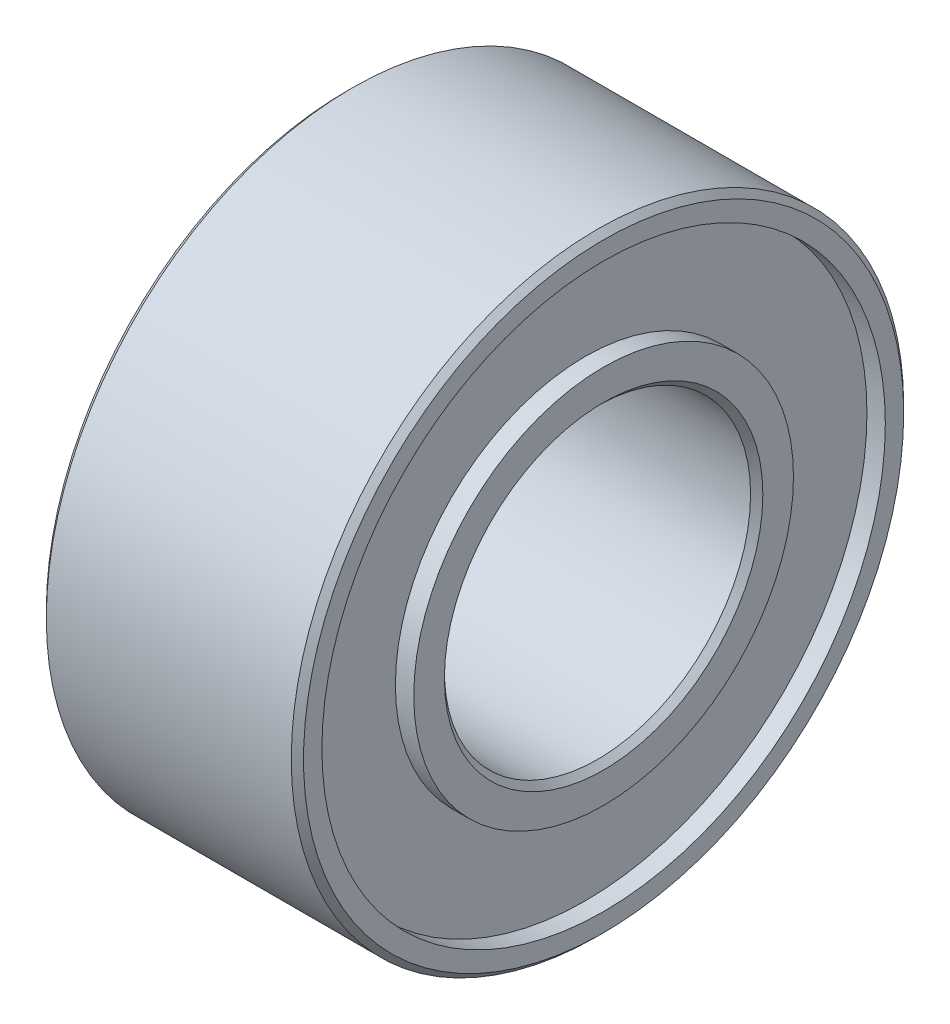
ISO-10303-21;
HEADER;
FILE_DESCRIPTION(('STEP AP214'),'2;1');
FILE_NAME('part.step','',(''),(''),'','','');
FILE_SCHEMA(('AUTOMOTIVE_DESIGN { 1 0 10303 214 1 1 1 1 }'));
ENDSEC;
DATA;
#1=APPLICATION_CONTEXT('core data for automotive mechanical design processes');
#2=APPLICATION_PROTOCOL_DEFINITION('international standard','automotive_design',2000,#1);
#3=PRODUCT_CONTEXT('',#1,'mechanical');
#4=PRODUCT('Part','Part','',(#3));
#5=PRODUCT_RELATED_PRODUCT_CATEGORY('part','',(#4));
#6=PRODUCT_DEFINITION_FORMATION('','',#4);
#7=PRODUCT_DEFINITION_CONTEXT('part definition',#1,'design');
#8=PRODUCT_DEFINITION('design','',#6,#7);
#9=PRODUCT_DEFINITION_SHAPE('','',#8);
#10=(LENGTH_UNIT() NAMED_UNIT(*) SI_UNIT(.MILLI.,.METRE.));
#11=(NAMED_UNIT(*) PLANE_ANGLE_UNIT() SI_UNIT($,.RADIAN.));
#12=(NAMED_UNIT(*) SI_UNIT($,.STERADIAN.) SOLID_ANGLE_UNIT());
#13=UNCERTAINTY_MEASURE_WITH_UNIT(LENGTH_MEASURE(1.E-05),#10,'distance_accuracy_value','');
#14=(GEOMETRIC_REPRESENTATION_CONTEXT(3) GLOBAL_UNCERTAINTY_ASSIGNED_CONTEXT((#13)) GLOBAL_UNIT_ASSIGNED_CONTEXT((#10,
#11,#12)) REPRESENTATION_CONTEXT('',''));
#15=CARTESIAN_POINT('',(0.,0.,0.));
#16=DIRECTION('',(0.,0.,1.));
#17=DIRECTION('',(1.,0.,0.));
#18=AXIS2_PLACEMENT_3D('',#15,#16,#17);
#19=CARTESIAN_POINT('',(-2.1,2.5,0.));
#20=DIRECTION('',(-1.,0.,0.));
#21=DIRECTION('',(0.,0.,1.));
#22=AXIS2_PLACEMENT_3D('',#19,#20,#21);
#23=PLANE('',#22);
#24=CARTESIAN_POINT('',(-2.1,0.,0.));
#25=DIRECTION('',(-1.,0.,0.));
#26=DIRECTION('',(0.,0.,1.));
#27=AXIS2_PLACEMENT_3D('',#24,#25,#26);
#28=CIRCLE('',#27,2.6);
#29=CARTESIAN_POINT('',(-2.1,0.,2.6));
#30=VERTEX_POINT('',#29);
#31=EDGE_CURVE('E73',#30,#30,#28,.F.);
#32=ORIENTED_EDGE('',*,*,#31,.T.);
#33=EDGE_LOOP('',(#32));
#34=FACE_BOUND('',#33,.T.);
#35=CARTESIAN_POINT('',(-2.1,0.,0.));
#36=DIRECTION('',(1.,0.,0.));
#37=DIRECTION('',(0.,0.,-1.));
#38=AXIS2_PLACEMENT_3D('',#35,#36,#37);
#39=CIRCLE('',#38,3.1);
#40=CARTESIAN_POINT('',(-2.1,0.,-3.1));
#41=VERTEX_POINT('',#40);
#42=EDGE_CURVE('E76',#41,#41,#39,.T.);
#43=ORIENTED_EDGE('',*,*,#42,.F.);
#44=EDGE_LOOP('',(#43));
#45=FACE_BOUND('',#44,.T.);
#46=ADVANCED_FACE('F43',(#34,#45),#23,.T.);
#47=CARTESIAN_POINT('',(0.,0.,0.));
#48=DIRECTION('',(1.,0.,0.));
#49=DIRECTION('',(0.,0.,-1.));
#50=AXIS2_PLACEMENT_3D('',#47,#48,#49);
#51=CYLINDRICAL_SURFACE('',#50,3.1);
#52=ORIENTED_EDGE('',*,*,#42,.T.);
#53=EDGE_LOOP('',(#52));
#54=FACE_BOUND('',#53,.T.);
#55=CARTESIAN_POINT('',(-1.8,0.,0.));
#56=DIRECTION('',(1.,0.,0.));
#57=DIRECTION('',(0.,0.,-1.));
#58=AXIS2_PLACEMENT_3D('',#55,#56,#57);
#59=CIRCLE('',#58,3.1);
#60=CARTESIAN_POINT('',(-1.8,0.,-3.1));
#61=VERTEX_POINT('',#60);
#62=EDGE_CURVE('E79',#61,#61,#59,.T.);
#63=ORIENTED_EDGE('',*,*,#62,.F.);
#64=EDGE_LOOP('',(#63));
#65=FACE_BOUND('',#64,.T.);
#66=ADVANCED_FACE('F120',(#54,#65),#51,.T.);
#67=CARTESIAN_POINT('',(-1.8,3.1,0.));
#68=DIRECTION('',(-1.,0.,0.));
#69=DIRECTION('',(0.,0.,1.));
#70=AXIS2_PLACEMENT_3D('',#67,#68,#69);
#71=PLANE('',#70);
#72=ORIENTED_EDGE('',*,*,#62,.T.);
#73=EDGE_LOOP('',(#72));
#74=FACE_BOUND('',#73,.T.);
#75=CARTESIAN_POINT('',(-1.8,0.,0.));
#76=DIRECTION('',(1.,0.,0.));
#77=DIRECTION('',(0.,0.,-1.));
#78=AXIS2_PLACEMENT_3D('',#75,#76,#77);
#79=CIRCLE('',#78,4.6);
#80=CARTESIAN_POINT('',(-1.8,0.,-4.6));
#81=VERTEX_POINT('',#80);
#82=EDGE_CURVE('E82',#81,#81,#79,.T.);
#83=ORIENTED_EDGE('',*,*,#82,.F.);
#84=EDGE_LOOP('',(#83));
#85=FACE_BOUND('',#84,.T.);
#86=ADVANCED_FACE('F127',(#74,#85),#71,.T.);
#87=CARTESIAN_POINT('',(0.,0.,0.));
#88=DIRECTION('',(1.,0.,0.));
#89=DIRECTION('',(0.,0.,-1.));
#90=AXIS2_PLACEMENT_3D('',#87,#88,#89);
#91=CYLINDRICAL_SURFACE('',#90,4.6);
#92=ORIENTED_EDGE('',*,*,#82,.T.);
#93=EDGE_LOOP('',(#92));
#94=FACE_BOUND('',#93,.T.);
#95=CARTESIAN_POINT('',(-2.1,0.,0.));
#96=DIRECTION('',(1.,0.,0.));
#97=DIRECTION('',(0.,0.,-1.));
#98=AXIS2_PLACEMENT_3D('',#95,#96,#97);
#99=CIRCLE('',#98,4.6);
#100=CARTESIAN_POINT('',(-2.1,0.,-4.6));
#101=VERTEX_POINT('',#100);
#102=EDGE_CURVE('E85',#101,#101,#99,.T.);
#103=ORIENTED_EDGE('',*,*,#102,.F.);
#104=EDGE_LOOP('',(#103));
#105=FACE_BOUND('',#104,.T.);
#106=ADVANCED_FACE('F171',(#94,#105),#91,.F.);
#107=CARTESIAN_POINT('',(-2.1,4.6,0.));
#108=DIRECTION('',(-1.,0.,0.));
#109=DIRECTION('',(0.,0.,1.));
#110=AXIS2_PLACEMENT_3D('',#107,#108,#109);
#111=PLANE('',#110);
#112=CARTESIAN_POINT('',(-2.1,0.,0.));
#113=DIRECTION('',(-1.,0.,0.));
#114=DIRECTION('',(0.,0.,1.));
#115=AXIS2_PLACEMENT_3D('',#112,#113,#114);
#116=CIRCLE('',#115,4.9);
#117=CARTESIAN_POINT('',(-2.1,0.,4.9));
#118=VERTEX_POINT('',#117);
#119=EDGE_CURVE('E51',#118,#118,#116,.T.);
#120=ORIENTED_EDGE('',*,*,#119,.T.);
#121=EDGE_LOOP('',(#120));
#122=FACE_BOUND('',#121,.T.);
#123=ORIENTED_EDGE('',*,*,#102,.T.);
#124=EDGE_LOOP('',(#123));
#125=FACE_BOUND('',#124,.T.);
#126=ADVANCED_FACE('F163',(#122,#125),#111,.T.);
#127=CARTESIAN_POINT('',(0.,0.,0.));
#128=DIRECTION('',(1.,0.,0.));
#129=DIRECTION('',(0.,0.,-1.));
#130=AXIS2_PLACEMENT_3D('',#127,#128,#129);
#131=CYLINDRICAL_SURFACE('',#130,5.);
#132=CARTESIAN_POINT('',(-2.,0.,0.));
#133=DIRECTION('',(-1.,0.,0.));
#134=DIRECTION('',(0.,0.,1.));
#135=AXIS2_PLACEMENT_3D('',#132,#133,#134);
#136=CIRCLE('',#135,5.);
#137=CARTESIAN_POINT('',(-2.,0.,5.));
#138=VERTEX_POINT('',#137);
#139=EDGE_CURVE('E55',#138,#138,#136,.F.);
#140=ORIENTED_EDGE('',*,*,#139,.T.);
#141=EDGE_LOOP('',(#140));
#142=FACE_BOUND('',#141,.T.);
#143=CARTESIAN_POINT('',(2.00000000000001,0.,0.));
#144=DIRECTION('',(1.,0.,0.));
#145=DIRECTION('',(0.,0.,-1.));
#146=AXIS2_PLACEMENT_3D('',#143,#144,#145);
#147=CIRCLE('',#146,5.);
#148=CARTESIAN_POINT('',(2.00000000000001,0.,-5.));
#149=VERTEX_POINT('',#148);
#150=EDGE_CURVE('E59',#149,#149,#147,.F.);
#151=ORIENTED_EDGE('',*,*,#150,.T.);
#152=EDGE_LOOP('',(#151));
#153=FACE_BOUND('',#152,.T.);
#154=ADVANCED_FACE('F159',(#142,#153),#131,.T.);
#155=CARTESIAN_POINT('',(2.1,4.6,0.));
#156=DIRECTION('',(1.,0.,0.));
#157=DIRECTION('',(0.,0.,-1.));
#158=AXIS2_PLACEMENT_3D('',#155,#156,#157);
#159=PLANE('',#158);
#160=CARTESIAN_POINT('',(2.1,0.,0.));
#161=DIRECTION('',(1.,0.,0.));
#162=DIRECTION('',(0.,0.,-1.));
#163=AXIS2_PLACEMENT_3D('',#160,#161,#162);
#164=CIRCLE('',#163,4.9);
#165=CARTESIAN_POINT('',(2.1,0.,-4.9));
#166=VERTEX_POINT('',#165);
#167=EDGE_CURVE('E10',#166,#166,#164,.T.);
#168=ORIENTED_EDGE('',*,*,#167,.T.);
#169=EDGE_LOOP('',(#168));
#170=FACE_BOUND('',#169,.T.);
#171=CARTESIAN_POINT('',(2.1,0.,0.));
#172=DIRECTION('',(1.,0.,0.));
#173=DIRECTION('',(0.,0.,-1.));
#174=AXIS2_PLACEMENT_3D('',#171,#172,#173);
#175=CIRCLE('',#174,4.6);
#176=CARTESIAN_POINT('',(2.1,0.,-4.6));
#177=VERTEX_POINT('',#176);
#178=EDGE_CURVE('E88',#177,#177,#175,.T.);
#179=ORIENTED_EDGE('',*,*,#178,.F.);
#180=EDGE_LOOP('',(#179));
#181=FACE_BOUND('',#180,.T.);
#182=ADVANCED_FACE('F162',(#170,#181),#159,.T.);
#183=CARTESIAN_POINT('',(0.,0.,0.));
#184=DIRECTION('',(1.,0.,0.));
#185=DIRECTION('',(0.,0.,-1.));
#186=AXIS2_PLACEMENT_3D('',#183,#184,#185);
#187=CYLINDRICAL_SURFACE('',#186,4.6);
#188=ORIENTED_EDGE('',*,*,#178,.T.);
#189=EDGE_LOOP('',(#188));
#190=FACE_BOUND('',#189,.T.);
#191=CARTESIAN_POINT('',(1.8,0.,0.));
#192=DIRECTION('',(1.,0.,0.));
#193=DIRECTION('',(0.,0.,-1.));
#194=AXIS2_PLACEMENT_3D('',#191,#192,#193);
#195=CIRCLE('',#194,4.6);
#196=CARTESIAN_POINT('',(1.8,0.,-4.6));
#197=VERTEX_POINT('',#196);
#198=EDGE_CURVE('E91',#197,#197,#195,.T.);
#199=ORIENTED_EDGE('',*,*,#198,.F.);
#200=EDGE_LOOP('',(#199));
#201=FACE_BOUND('',#200,.T.);
#202=ADVANCED_FACE('F117',(#190,#201),#187,.F.);
#203=CARTESIAN_POINT('',(1.8,3.1,0.));
#204=DIRECTION('',(1.,0.,0.));
#205=DIRECTION('',(0.,0.,-1.));
#206=AXIS2_PLACEMENT_3D('',#203,#204,#205);
#207=PLANE('',#206);
#208=ORIENTED_EDGE('',*,*,#198,.T.);
#209=EDGE_LOOP('',(#208));
#210=FACE_BOUND('',#209,.T.);
#211=CARTESIAN_POINT('',(1.8,0.,0.));
#212=DIRECTION('',(1.,0.,0.));
#213=DIRECTION('',(0.,0.,-1.));
#214=AXIS2_PLACEMENT_3D('',#211,#212,#213);
#215=CIRCLE('',#214,3.1);
#216=CARTESIAN_POINT('',(1.8,0.,-3.1));
#217=VERTEX_POINT('',#216);
#218=EDGE_CURVE('E94',#217,#217,#215,.T.);
#219=ORIENTED_EDGE('',*,*,#218,.F.);
#220=EDGE_LOOP('',(#219));
#221=FACE_BOUND('',#220,.T.);
#222=ADVANCED_FACE('F105',(#210,#221),#207,.T.);
#223=CARTESIAN_POINT('',(0.,0.,0.));
#224=DIRECTION('',(1.,0.,0.));
#225=DIRECTION('',(0.,0.,-1.));
#226=AXIS2_PLACEMENT_3D('',#223,#224,#225);
#227=CYLINDRICAL_SURFACE('',#226,3.1);
#228=ORIENTED_EDGE('',*,*,#218,.T.);
#229=EDGE_LOOP('',(#228));
#230=FACE_BOUND('',#229,.T.);
#231=CARTESIAN_POINT('',(2.1,0.,0.));
#232=DIRECTION('',(1.,0.,0.));
#233=DIRECTION('',(0.,0.,-1.));
#234=AXIS2_PLACEMENT_3D('',#231,#232,#233);
#235=CIRCLE('',#234,3.1);
#236=CARTESIAN_POINT('',(2.1,0.,-3.1));
#237=VERTEX_POINT('',#236);
#238=EDGE_CURVE('E97',#237,#237,#235,.T.);
#239=ORIENTED_EDGE('',*,*,#238,.F.);
#240=EDGE_LOOP('',(#239));
#241=FACE_BOUND('',#240,.T.);
#242=ADVANCED_FACE('F103',(#230,#241),#227,.T.);
#243=CARTESIAN_POINT('',(2.1,2.5,0.));
#244=DIRECTION('',(1.,0.,0.));
#245=DIRECTION('',(0.,0.,-1.));
#246=AXIS2_PLACEMENT_3D('',#243,#244,#245);
#247=PLANE('',#246);
#248=CARTESIAN_POINT('',(2.1,0.,0.));
#249=DIRECTION('',(1.,0.,0.));
#250=DIRECTION('',(0.,0.,-1.));
#251=AXIS2_PLACEMENT_3D('',#248,#249,#250);
#252=CIRCLE('',#251,2.6);
#253=CARTESIAN_POINT('',(2.1,0.,-2.6));
#254=VERTEX_POINT('',#253);
#255=EDGE_CURVE('E64',#254,#254,#252,.F.);
#256=ORIENTED_EDGE('',*,*,#255,.T.);
#257=EDGE_LOOP('',(#256));
#258=FACE_BOUND('',#257,.T.);
#259=ORIENTED_EDGE('',*,*,#238,.T.);
#260=EDGE_LOOP('',(#259));
#261=FACE_BOUND('',#260,.T.);
#262=ADVANCED_FACE('F101',(#258,#261),#247,.T.);
#263=CARTESIAN_POINT('',(0.,0.,0.));
#264=DIRECTION('',(1.,0.,0.));
#265=DIRECTION('',(0.,0.,-1.));
#266=AXIS2_PLACEMENT_3D('',#263,#264,#265);
#267=CYLINDRICAL_SURFACE('',#266,2.5);
#268=CARTESIAN_POINT('',(-2.,0.,0.));
#269=DIRECTION('',(-1.,0.,0.));
#270=DIRECTION('',(0.,0.,1.));
#271=AXIS2_PLACEMENT_3D('',#268,#269,#270);
#272=CIRCLE('',#271,2.5);
#273=CARTESIAN_POINT('',(-2.,0.,2.5));
#274=VERTEX_POINT('',#273);
#275=EDGE_CURVE('E67',#274,#274,#272,.T.);
#276=ORIENTED_EDGE('',*,*,#275,.T.);
#277=EDGE_LOOP('',(#276));
#278=FACE_BOUND('',#277,.T.);
#279=CARTESIAN_POINT('',(2.,0.,0.));
#280=DIRECTION('',(1.,0.,0.));
#281=DIRECTION('',(0.,0.,-1.));
#282=AXIS2_PLACEMENT_3D('',#279,#280,#281);
#283=CIRCLE('',#282,2.5);
#284=CARTESIAN_POINT('',(2.,0.,-2.5));
#285=VERTEX_POINT('',#284);
#286=EDGE_CURVE('E70',#285,#285,#283,.T.);
#287=ORIENTED_EDGE('',*,*,#286,.T.);
#288=EDGE_LOOP('',(#287));
#289=FACE_BOUND('',#288,.T.);
#290=ADVANCED_FACE('F113',(#278,#289),#267,.F.);
#291=CARTESIAN_POINT('',(-2.1,0.,0.));
#292=DIRECTION('',(-1.,0.,0.));
#293=DIRECTION('',(0.,0.,1.));
#294=AXIS2_PLACEMENT_3D('',#291,#292,#293);
#295=CONICAL_SURFACE('',#294,2.6,0.785398163397455);
#296=ORIENTED_EDGE('',*,*,#275,.F.);
#297=EDGE_LOOP('',(#296));
#298=FACE_BOUND('',#297,.T.);
#299=ORIENTED_EDGE('',*,*,#31,.F.);
#300=EDGE_LOOP('',(#299));
#301=FACE_BOUND('',#300,.T.);
#302=ADVANCED_FACE('F134',(#298,#301),#295,.F.);
#303=CARTESIAN_POINT('',(2.,0.,0.));
#304=DIRECTION('',(1.,0.,0.));
#305=DIRECTION('',(0.,0.,-1.));
#306=AXIS2_PLACEMENT_3D('',#303,#304,#305);
#307=CONICAL_SURFACE('',#306,2.5,0.78539816339745);
#308=ORIENTED_EDGE('',*,*,#255,.F.);
#309=EDGE_LOOP('',(#308));
#310=FACE_BOUND('',#309,.T.);
#311=ORIENTED_EDGE('',*,*,#286,.F.);
#312=EDGE_LOOP('',(#311));
#313=FACE_BOUND('',#312,.T.);
#314=ADVANCED_FACE('F140',(#310,#313),#307,.F.);
#315=CARTESIAN_POINT('',(-2.,0.,0.));
#316=DIRECTION('',(1.,0.,0.));
#317=DIRECTION('',(0.,0.,-1.));
#318=AXIS2_PLACEMENT_3D('',#315,#316,#317);
#319=CONICAL_SURFACE('',#318,5.,0.785398163397453);
#320=ORIENTED_EDGE('',*,*,#119,.F.);
#321=EDGE_LOOP('',(#320));
#322=FACE_BOUND('',#321,.T.);
#323=ORIENTED_EDGE('',*,*,#139,.F.);
#324=EDGE_LOOP('',(#323));
#325=FACE_BOUND('',#324,.T.);
#326=ADVANCED_FACE('F146',(#322,#325),#319,.T.);
#327=CARTESIAN_POINT('',(2.1,0.,0.));
#328=DIRECTION('',(-1.,0.,0.));
#329=DIRECTION('',(0.,0.,1.));
#330=AXIS2_PLACEMENT_3D('',#327,#328,#329);
#331=CONICAL_SURFACE('',#330,4.9,0.785398163397448);
#332=ORIENTED_EDGE('',*,*,#150,.F.);
#333=EDGE_LOOP('',(#332));
#334=FACE_BOUND('',#333,.T.);
#335=ORIENTED_EDGE('',*,*,#167,.F.);
#336=EDGE_LOOP('',(#335));
#337=FACE_BOUND('',#336,.T.);
#338=ADVANCED_FACE('F46',(#334,#337),#331,.T.);
#339=CLOSED_SHELL('',(#46,#66,#86,#106,#126,#154,#182,#202,#222,#242,#262,#290,#302,#314,#326,#338));
#340=MANIFOLD_SOLID_BREP('B2',#339);
#341=ADVANCED_BREP_SHAPE_REPRESENTATION('',(#18,#340),#14);
#342=SHAPE_DEFINITION_REPRESENTATION(#9,#341);
ENDSEC;
END-ISO-10303-21;
